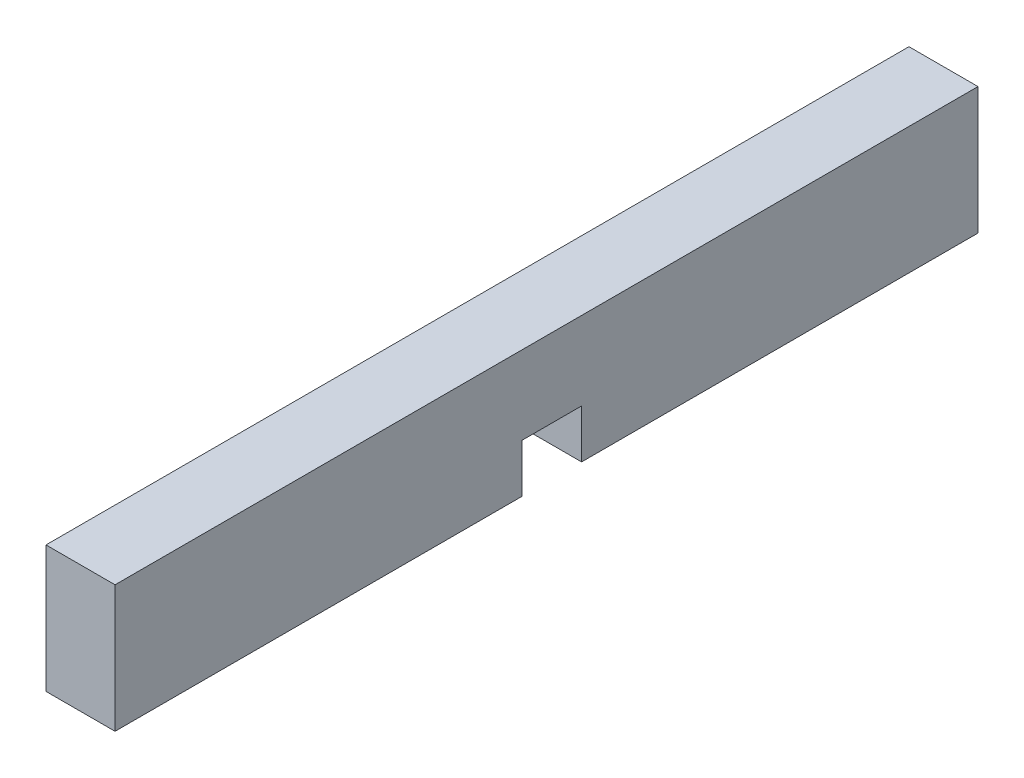
ISO-10303-21;
HEADER;
FILE_DESCRIPTION(('STEP AP214'),'2;1');
FILE_NAME('part.step','',(''),(''),'','','');
FILE_SCHEMA(('AUTOMOTIVE_DESIGN { 1 0 10303 214 1 1 1 1 }'));
ENDSEC;
DATA;
#1=APPLICATION_CONTEXT('core data for automotive mechanical design processes');
#2=APPLICATION_PROTOCOL_DEFINITION('international standard','automotive_design',2000,#1);
#3=PRODUCT_CONTEXT('',#1,'mechanical');
#4=PRODUCT('Part','Part','',(#3));
#5=PRODUCT_RELATED_PRODUCT_CATEGORY('part','',(#4));
#6=PRODUCT_DEFINITION_FORMATION('','',#4);
#7=PRODUCT_DEFINITION_CONTEXT('part definition',#1,'design');
#8=PRODUCT_DEFINITION('design','',#6,#7);
#9=PRODUCT_DEFINITION_SHAPE('','',#8);
#10=(LENGTH_UNIT() NAMED_UNIT(*) SI_UNIT(.MILLI.,.METRE.));
#11=(NAMED_UNIT(*) PLANE_ANGLE_UNIT() SI_UNIT($,.RADIAN.));
#12=(NAMED_UNIT(*) SI_UNIT($,.STERADIAN.) SOLID_ANGLE_UNIT());
#13=UNCERTAINTY_MEASURE_WITH_UNIT(LENGTH_MEASURE(1.E-05),#10,'distance_accuracy_value','');
#14=(GEOMETRIC_REPRESENTATION_CONTEXT(3) GLOBAL_UNCERTAINTY_ASSIGNED_CONTEXT((#13)) GLOBAL_UNIT_ASSIGNED_CONTEXT((#10,
#11,#12)) REPRESENTATION_CONTEXT('',''));
#15=CARTESIAN_POINT('',(0.,0.,0.));
#16=DIRECTION('',(0.,0.,1.));
#17=DIRECTION('',(1.,0.,0.));
#18=AXIS2_PLACEMENT_3D('',#15,#16,#17);
#19=CARTESIAN_POINT('',(2.3495,-4.318,29.3624));
#20=DIRECTION('',(0.,1.,0.));
#21=DIRECTION('',(0.,0.,1.));
#22=AXIS2_PLACEMENT_3D('',#19,#20,#21);
#23=PLANE('',#22);
#24=DIRECTION('',(0.,0.,-1.));
#25=VECTOR('',#24,1.);
#26=CARTESIAN_POINT('',(-2.3495,-4.318,29.3624));
#27=LINE('',#26,#25);
#28=CARTESIAN_POINT('',(-2.3495,-4.318,29.3624));
#29=VERTEX_POINT('',#28);
#30=CARTESIAN_POINT('',(-2.3495,-4.318,1.6764));
#31=VERTEX_POINT('',#30);
#32=EDGE_CURVE('E139',#29,#31,#27,.T.);
#33=ORIENTED_EDGE('',*,*,#32,.T.);
#34=DIRECTION('',(1.,0.,0.));
#35=VECTOR('',#34,1.);
#36=CARTESIAN_POINT('',(-58.2295,-4.318,1.6764));
#37=LINE('',#36,#35);
#38=CARTESIAN_POINT('',(2.3495,-4.318,1.6764));
#39=VERTEX_POINT('',#38);
#40=EDGE_CURVE('E121',#31,#39,#37,.T.);
#41=ORIENTED_EDGE('',*,*,#40,.T.);
#42=DIRECTION('',(0.,0.,-1.));
#43=VECTOR('',#42,1.);
#44=CARTESIAN_POINT('',(2.3495,-4.318,29.3624));
#45=LINE('',#44,#43);
#46=CARTESIAN_POINT('',(2.3495,-4.318,29.3624));
#47=VERTEX_POINT('',#46);
#48=EDGE_CURVE('E157',#47,#39,#45,.T.);
#49=ORIENTED_EDGE('',*,*,#48,.F.);
#50=DIRECTION('',(-1.,0.,0.));
#51=VECTOR('',#50,1.);
#52=CARTESIAN_POINT('',(2.3495,-4.318,29.3624));
#53=LINE('',#52,#51);
#54=EDGE_CURVE('E143',#47,#29,#53,.T.);
#55=ORIENTED_EDGE('',*,*,#54,.T.);
#56=EDGE_LOOP('',(#33,#41,#49,#55));
#57=FACE_BOUND('',#56,.T.);
#58=ADVANCED_FACE('F45',(#57),#23,.F.);
#59=CARTESIAN_POINT('',(2.3495,4.318,-29.3624));
#60=DIRECTION('',(0.,0.,1.));
#61=DIRECTION('',(1.,0.,0.));
#62=AXIS2_PLACEMENT_3D('',#59,#60,#61);
#63=PLANE('',#62);
#64=DIRECTION('',(0.,1.,0.));
#65=VECTOR('',#64,1.);
#66=CARTESIAN_POINT('',(-2.3495,4.318,-29.3624));
#67=LINE('',#66,#65);
#68=CARTESIAN_POINT('',(-2.3495,-4.318,-29.3624));
#69=VERTEX_POINT('',#68);
#70=CARTESIAN_POINT('',(-2.3495,4.318,-29.3624));
#71=VERTEX_POINT('',#70);
#72=EDGE_CURVE('E180',#69,#71,#67,.T.);
#73=ORIENTED_EDGE('',*,*,#72,.T.);
#74=DIRECTION('',(-1.,0.,0.));
#75=VECTOR('',#74,1.);
#76=CARTESIAN_POINT('',(2.3495,4.318,-29.3624));
#77=LINE('',#76,#75);
#78=CARTESIAN_POINT('',(2.3495,4.318,-29.3624));
#79=VERTEX_POINT('',#78);
#80=EDGE_CURVE('E164',#79,#71,#77,.T.);
#81=ORIENTED_EDGE('',*,*,#80,.F.);
#82=DIRECTION('',(0.,1.,0.));
#83=VECTOR('',#82,1.);
#84=CARTESIAN_POINT('',(2.3495,4.318,-29.3624));
#85=LINE('',#84,#83);
#86=CARTESIAN_POINT('',(2.3495,-4.318,-29.3624));
#87=VERTEX_POINT('',#86);
#88=EDGE_CURVE('E145',#87,#79,#85,.T.);
#89=ORIENTED_EDGE('',*,*,#88,.F.);
#90=DIRECTION('',(-1.,0.,0.));
#91=VECTOR('',#90,1.);
#92=CARTESIAN_POINT('',(2.3495,-4.318,-29.3624));
#93=LINE('',#92,#91);
#94=EDGE_CURVE('E154',#87,#69,#93,.T.);
#95=ORIENTED_EDGE('',*,*,#94,.T.);
#96=EDGE_LOOP('',(#73,#81,#89,#95));
#97=FACE_BOUND('',#96,.T.);
#98=ADVANCED_FACE('F47',(#97),#63,.F.);
#99=CARTESIAN_POINT('',(2.3495,4.318,29.3624));
#100=DIRECTION('',(0.,-1.,0.));
#101=DIRECTION('',(0.,0.,-1.));
#102=AXIS2_PLACEMENT_3D('',#99,#100,#101);
#103=PLANE('',#102);
#104=DIRECTION('',(0.,0.,1.));
#105=VECTOR('',#104,1.);
#106=CARTESIAN_POINT('',(-2.3495,4.318,29.3624));
#107=LINE('',#106,#105);
#108=CARTESIAN_POINT('',(-2.3495,4.318,29.3624));
#109=VERTEX_POINT('',#108);
#110=EDGE_CURVE('E183',#71,#109,#107,.T.);
#111=ORIENTED_EDGE('',*,*,#110,.T.);
#112=DIRECTION('',(-1.,0.,0.));
#113=VECTOR('',#112,1.);
#114=CARTESIAN_POINT('',(2.3495,4.318,29.3624));
#115=LINE('',#114,#113);
#116=CARTESIAN_POINT('',(2.3495,4.318,29.3624));
#117=VERTEX_POINT('',#116);
#118=EDGE_CURVE('E160',#117,#109,#115,.T.);
#119=ORIENTED_EDGE('',*,*,#118,.F.);
#120=DIRECTION('',(0.,0.,1.));
#121=VECTOR('',#120,1.);
#122=CARTESIAN_POINT('',(2.3495,4.318,29.3624));
#123=LINE('',#122,#121);
#124=EDGE_CURVE('E100',#79,#117,#123,.T.);
#125=ORIENTED_EDGE('',*,*,#124,.F.);
#126=ORIENTED_EDGE('',*,*,#80,.T.);
#127=EDGE_LOOP('',(#111,#119,#125,#126));
#128=FACE_BOUND('',#127,.T.);
#129=ADVANCED_FACE('F191',(#128),#103,.F.);
#130=CARTESIAN_POINT('',(2.3495,4.318,29.3624));
#131=DIRECTION('',(0.,0.,-1.));
#132=DIRECTION('',(-1.,0.,0.));
#133=AXIS2_PLACEMENT_3D('',#130,#131,#132);
#134=PLANE('',#133);
#135=DIRECTION('',(0.,-1.,0.));
#136=VECTOR('',#135,1.);
#137=CARTESIAN_POINT('',(-2.3495,4.318,29.3624));
#138=LINE('',#137,#136);
#139=EDGE_CURVE('E150',#109,#29,#138,.T.);
#140=ORIENTED_EDGE('',*,*,#139,.T.);
#141=ORIENTED_EDGE('',*,*,#54,.F.);
#142=DIRECTION('',(0.,-1.,0.));
#143=VECTOR('',#142,1.);
#144=CARTESIAN_POINT('',(2.3495,4.318,29.3624));
#145=LINE('',#144,#143);
#146=EDGE_CURVE('E174',#117,#47,#145,.T.);
#147=ORIENTED_EDGE('',*,*,#146,.F.);
#148=ORIENTED_EDGE('',*,*,#118,.T.);
#149=EDGE_LOOP('',(#140,#141,#147,#148));
#150=FACE_BOUND('',#149,.T.);
#151=ADVANCED_FACE('F187',(#150),#134,.F.);
#152=CARTESIAN_POINT('',(2.3495,-4.318,-2.3876));
#153=VERTEX_POINT('',#152);
#154=EDGE_CURVE('E70',#153,#87,#45,.T.);
#155=ORIENTED_EDGE('',*,*,#154,.F.);
#156=DIRECTION('',(1.,0.,0.));
#157=VECTOR('',#156,1.);
#158=CARTESIAN_POINT('',(-58.2295,-4.318,-2.3876));
#159=LINE('',#158,#157);
#160=CARTESIAN_POINT('',(-2.3495,-4.318,-2.3876));
#161=VERTEX_POINT('',#160);
#162=EDGE_CURVE('E132',#161,#153,#159,.T.);
#163=ORIENTED_EDGE('',*,*,#162,.F.);
#164=EDGE_CURVE('E92',#161,#69,#27,.T.);
#165=ORIENTED_EDGE('',*,*,#164,.T.);
#166=ORIENTED_EDGE('',*,*,#94,.F.);
#167=EDGE_LOOP('',(#155,#163,#165,#166));
#168=FACE_BOUND('',#167,.T.);
#169=ADVANCED_FACE('F194',(#168),#23,.F.);
#170=CARTESIAN_POINT('',(2.3495,0.,0.));
#171=DIRECTION('',(1.,0.,0.));
#172=DIRECTION('',(0.,0.,-1.));
#173=AXIS2_PLACEMENT_3D('',#170,#171,#172);
#174=PLANE('',#173);
#175=DIRECTION('',(0.,-1.,0.));
#176=VECTOR('',#175,1.);
#177=CARTESIAN_POINT('',(2.3495,0.,1.6764));
#178=LINE('',#177,#176);
#179=CARTESIAN_POINT('',(2.3495,-1.016,1.6764));
#180=VERTEX_POINT('',#179);
#181=EDGE_CURVE('E126',#180,#39,#178,.T.);
#182=ORIENTED_EDGE('',*,*,#181,.F.);
#183=DIRECTION('',(0.,0.,1.));
#184=VECTOR('',#183,1.);
#185=CARTESIAN_POINT('',(2.3495,-1.016,0.));
#186=LINE('',#185,#184);
#187=CARTESIAN_POINT('',(2.3495,-1.016,-2.3876));
#188=VERTEX_POINT('',#187);
#189=EDGE_CURVE('E280',#188,#180,#186,.T.);
#190=ORIENTED_EDGE('',*,*,#189,.F.);
#191=DIRECTION('',(0.,1.,0.));
#192=VECTOR('',#191,1.);
#193=CARTESIAN_POINT('',(2.3495,0.,-2.3876));
#194=LINE('',#193,#192);
#195=EDGE_CURVE('E198',#153,#188,#194,.T.);
#196=ORIENTED_EDGE('',*,*,#195,.F.);
#197=ORIENTED_EDGE('',*,*,#154,.T.);
#198=ORIENTED_EDGE('',*,*,#88,.T.);
#199=ORIENTED_EDGE('',*,*,#124,.T.);
#200=ORIENTED_EDGE('',*,*,#146,.T.);
#201=ORIENTED_EDGE('',*,*,#48,.T.);
#202=EDGE_LOOP('',(#182,#190,#196,#197,#198,#199,#200,#201));
#203=FACE_BOUND('',#202,.T.);
#204=ADVANCED_FACE('F217',(#203),#174,.T.);
#205=CARTESIAN_POINT('',(-2.3495,0.,0.));
#206=DIRECTION('',(1.,0.,0.));
#207=DIRECTION('',(0.,0.,-1.));
#208=AXIS2_PLACEMENT_3D('',#205,#206,#207);
#209=PLANE('',#208);
#210=DIRECTION('',(0.,0.,1.));
#211=VECTOR('',#210,1.);
#212=CARTESIAN_POINT('',(-2.3495,-1.016,0.));
#213=LINE('',#212,#211);
#214=CARTESIAN_POINT('',(-2.3495,-1.016,-2.3876));
#215=VERTEX_POINT('',#214);
#216=CARTESIAN_POINT('',(-2.3495,-1.016,1.6764));
#217=VERTEX_POINT('',#216);
#218=EDGE_CURVE('E54',#215,#217,#213,.T.);
#219=ORIENTED_EDGE('',*,*,#218,.T.);
#220=DIRECTION('',(0.,-1.,0.));
#221=VECTOR('',#220,1.);
#222=CARTESIAN_POINT('',(-2.3495,0.,1.6764));
#223=LINE('',#222,#221);
#224=EDGE_CURVE('E11',#217,#31,#223,.T.);
#225=ORIENTED_EDGE('',*,*,#224,.T.);
#226=ORIENTED_EDGE('',*,*,#32,.F.);
#227=ORIENTED_EDGE('',*,*,#139,.F.);
#228=ORIENTED_EDGE('',*,*,#110,.F.);
#229=ORIENTED_EDGE('',*,*,#72,.F.);
#230=ORIENTED_EDGE('',*,*,#164,.F.);
#231=DIRECTION('',(0.,1.,0.));
#232=VECTOR('',#231,1.);
#233=CARTESIAN_POINT('',(-2.3495,0.,-2.3876));
#234=LINE('',#233,#232);
#235=EDGE_CURVE('E167',#161,#215,#234,.T.);
#236=ORIENTED_EDGE('',*,*,#235,.T.);
#237=EDGE_LOOP('',(#219,#225,#226,#227,#228,#229,#230,#236));
#238=FACE_BOUND('',#237,.T.);
#239=ADVANCED_FACE('F137',(#238),#209,.F.);
#240=CARTESIAN_POINT('',(-58.2295,-4.318,1.6764));
#241=DIRECTION('',(0.,0.,1.));
#242=DIRECTION('',(1.,0.,0.));
#243=AXIS2_PLACEMENT_3D('',#240,#241,#242);
#244=PLANE('',#243);
#245=ORIENTED_EDGE('',*,*,#181,.T.);
#246=ORIENTED_EDGE('',*,*,#40,.F.);
#247=ORIENTED_EDGE('',*,*,#224,.F.);
#248=DIRECTION('',(1.,0.,0.));
#249=VECTOR('',#248,1.);
#250=CARTESIAN_POINT('',(-58.2295,-1.016,1.6764));
#251=LINE('',#250,#249);
#252=EDGE_CURVE('E286',#217,#180,#251,.T.);
#253=ORIENTED_EDGE('',*,*,#252,.T.);
#254=EDGE_LOOP('',(#245,#246,#247,#253));
#255=FACE_BOUND('',#254,.T.);
#256=ADVANCED_FACE('F122',(#255),#244,.F.);
#257=CARTESIAN_POINT('',(-58.2295,-1.016,1.6764));
#258=DIRECTION('',(0.,1.,0.));
#259=DIRECTION('',(0.,0.,1.));
#260=AXIS2_PLACEMENT_3D('',#257,#258,#259);
#261=PLANE('',#260);
#262=ORIENTED_EDGE('',*,*,#189,.T.);
#263=ORIENTED_EDGE('',*,*,#252,.F.);
#264=ORIENTED_EDGE('',*,*,#218,.F.);
#265=DIRECTION('',(1.,0.,0.));
#266=VECTOR('',#265,1.);
#267=CARTESIAN_POINT('',(-58.2295,-1.016,-2.3876));
#268=LINE('',#267,#266);
#269=EDGE_CURVE('E61',#215,#188,#268,.T.);
#270=ORIENTED_EDGE('',*,*,#269,.T.);
#271=EDGE_LOOP('',(#262,#263,#264,#270));
#272=FACE_BOUND('',#271,.T.);
#273=ADVANCED_FACE('F200',(#272),#261,.F.);
#274=CARTESIAN_POINT('',(-58.2295,-4.318,-2.3876));
#275=DIRECTION('',(0.,0.,-1.));
#276=DIRECTION('',(-1.,0.,0.));
#277=AXIS2_PLACEMENT_3D('',#274,#275,#276);
#278=PLANE('',#277);
#279=ORIENTED_EDGE('',*,*,#195,.T.);
#280=ORIENTED_EDGE('',*,*,#269,.F.);
#281=ORIENTED_EDGE('',*,*,#235,.F.);
#282=ORIENTED_EDGE('',*,*,#162,.T.);
#283=EDGE_LOOP('',(#279,#280,#281,#282));
#284=FACE_BOUND('',#283,.T.);
#285=ADVANCED_FACE('F197',(#284),#278,.F.);
#286=CLOSED_SHELL('',(#58,#98,#129,#151,#169,#204,#239,#256,#273,#285));
#287=MANIFOLD_SOLID_BREP('B2',#286);
#288=ADVANCED_BREP_SHAPE_REPRESENTATION('',(#18,#287),#14);
#289=SHAPE_DEFINITION_REPRESENTATION(#9,#288);
ENDSEC;
END-ISO-10303-21;
